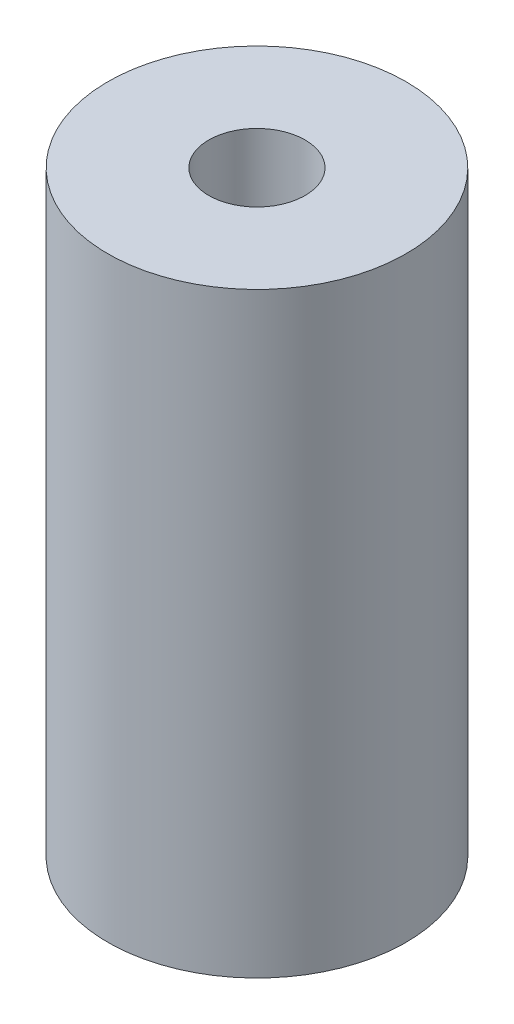
ISO-10303-21;
HEADER;
FILE_DESCRIPTION(('STEP AP214'),'2;1');
FILE_NAME('part.step','',(''),(''),'','','');
FILE_SCHEMA(('AUTOMOTIVE_DESIGN { 1 0 10303 214 1 1 1 1 }'));
ENDSEC;
DATA;
#1=APPLICATION_CONTEXT('core data for automotive mechanical design processes');
#2=APPLICATION_PROTOCOL_DEFINITION('international standard','automotive_design',2000,#1);
#3=PRODUCT_CONTEXT('',#1,'mechanical');
#4=PRODUCT('Part','Part','',(#3));
#5=PRODUCT_RELATED_PRODUCT_CATEGORY('part','',(#4));
#6=PRODUCT_DEFINITION_FORMATION('','',#4);
#7=PRODUCT_DEFINITION_CONTEXT('part definition',#1,'design');
#8=PRODUCT_DEFINITION('design','',#6,#7);
#9=PRODUCT_DEFINITION_SHAPE('','',#8);
#10=(LENGTH_UNIT() NAMED_UNIT(*) SI_UNIT(.MILLI.,.METRE.));
#11=(NAMED_UNIT(*) PLANE_ANGLE_UNIT() SI_UNIT($,.RADIAN.));
#12=(NAMED_UNIT(*) SI_UNIT($,.STERADIAN.) SOLID_ANGLE_UNIT());
#13=UNCERTAINTY_MEASURE_WITH_UNIT(LENGTH_MEASURE(1.E-05),#10,'distance_accuracy_value','');
#14=(GEOMETRIC_REPRESENTATION_CONTEXT(3) GLOBAL_UNCERTAINTY_ASSIGNED_CONTEXT((#13)) GLOBAL_UNIT_ASSIGNED_CONTEXT((#10,
#11,#12)) REPRESENTATION_CONTEXT('',''));
#15=CARTESIAN_POINT('',(0.,0.,0.));
#16=DIRECTION('',(0.,0.,1.));
#17=DIRECTION('',(1.,0.,0.));
#18=AXIS2_PLACEMENT_3D('',#15,#16,#17);
#19=CARTESIAN_POINT('',(0.,30.,0.));
#20=DIRECTION('',(0.,-1.,0.));
#21=DIRECTION('',(0.,0.,-1.));
#22=AXIS2_PLACEMENT_3D('',#19,#20,#21);
#23=CYLINDRICAL_SURFACE('',#22,2.42307692307692);
#24=CARTESIAN_POINT('',(0.,0.,0.));
#25=DIRECTION('',(0.,-1.,0.));
#26=DIRECTION('',(0.,0.,-1.));
#27=AXIS2_PLACEMENT_3D('',#24,#25,#26);
#28=CIRCLE('',#27,2.42307692307692);
#29=CARTESIAN_POINT('',(0.,0.,-2.42307692307692));
#30=VERTEX_POINT('',#29);
#31=EDGE_CURVE('E10',#30,#30,#28,.T.);
#32=ORIENTED_EDGE('',*,*,#31,.T.);
#33=EDGE_LOOP('',(#32));
#34=FACE_BOUND('',#33,.T.);
#35=CARTESIAN_POINT('',(0.,30.,0.));
#36=DIRECTION('',(0.,-1.,0.));
#37=DIRECTION('',(0.,0.,-1.));
#38=AXIS2_PLACEMENT_3D('',#35,#36,#37);
#39=CIRCLE('',#38,2.42307692307692);
#40=CARTESIAN_POINT('',(0.,30.,-2.42307692307692));
#41=VERTEX_POINT('',#40);
#42=EDGE_CURVE('E54',#41,#41,#39,.T.);
#43=ORIENTED_EDGE('',*,*,#42,.F.);
#44=EDGE_LOOP('',(#43));
#45=FACE_BOUND('',#44,.T.);
#46=ADVANCED_FACE('F37',(#34,#45),#23,.F.);
#47=CARTESIAN_POINT('',(2.42307692307692,0.,0.));
#48=DIRECTION('',(0.,-1.,0.));
#49=DIRECTION('',(0.,0.,-1.));
#50=AXIS2_PLACEMENT_3D('',#47,#48,#49);
#51=PLANE('',#50);
#52=CARTESIAN_POINT('',(0.,0.,0.));
#53=DIRECTION('',(0.,-1.,0.));
#54=DIRECTION('',(0.,0.,-1.));
#55=AXIS2_PLACEMENT_3D('',#52,#53,#54);
#56=CIRCLE('',#55,7.5);
#57=CARTESIAN_POINT('',(0.,0.,-7.5));
#58=VERTEX_POINT('',#57);
#59=EDGE_CURVE('E44',#58,#58,#56,.T.);
#60=ORIENTED_EDGE('',*,*,#59,.T.);
#61=EDGE_LOOP('',(#60));
#62=FACE_BOUND('',#61,.T.);
#63=ORIENTED_EDGE('',*,*,#31,.F.);
#64=EDGE_LOOP('',(#63));
#65=FACE_BOUND('',#64,.T.);
#66=ADVANCED_FACE('F65',(#62,#65),#51,.T.);
#67=CARTESIAN_POINT('',(0.,30.,0.));
#68=DIRECTION('',(0.,-1.,0.));
#69=DIRECTION('',(0.,0.,-1.));
#70=AXIS2_PLACEMENT_3D('',#67,#68,#69);
#71=CYLINDRICAL_SURFACE('',#70,7.5);
#72=CARTESIAN_POINT('',(0.,30.,0.));
#73=DIRECTION('',(0.,-1.,0.));
#74=DIRECTION('',(0.,0.,-1.));
#75=AXIS2_PLACEMENT_3D('',#72,#73,#74);
#76=CIRCLE('',#75,7.5);
#77=CARTESIAN_POINT('',(0.,30.,-7.5));
#78=VERTEX_POINT('',#77);
#79=EDGE_CURVE('E49',#78,#78,#76,.T.);
#80=ORIENTED_EDGE('',*,*,#79,.T.);
#81=EDGE_LOOP('',(#80));
#82=FACE_BOUND('',#81,.T.);
#83=ORIENTED_EDGE('',*,*,#59,.F.);
#84=EDGE_LOOP('',(#83));
#85=FACE_BOUND('',#84,.T.);
#86=ADVANCED_FACE('F69',(#82,#85),#71,.T.);
#87=CARTESIAN_POINT('',(7.5,30.,0.));
#88=DIRECTION('',(0.,1.,0.));
#89=DIRECTION('',(0.,0.,1.));
#90=AXIS2_PLACEMENT_3D('',#87,#88,#89);
#91=PLANE('',#90);
#92=ORIENTED_EDGE('',*,*,#42,.T.);
#93=EDGE_LOOP('',(#92));
#94=FACE_BOUND('',#93,.T.);
#95=ORIENTED_EDGE('',*,*,#79,.F.);
#96=EDGE_LOOP('',(#95));
#97=FACE_BOUND('',#96,.T.);
#98=ADVANCED_FACE('F61',(#94,#97),#91,.T.);
#99=CLOSED_SHELL('',(#46,#66,#86,#98));
#100=MANIFOLD_SOLID_BREP('B2',#99);
#101=ADVANCED_BREP_SHAPE_REPRESENTATION('',(#18,#100),#14);
#102=SHAPE_DEFINITION_REPRESENTATION(#9,#101);
ENDSEC;
END-ISO-10303-21;
